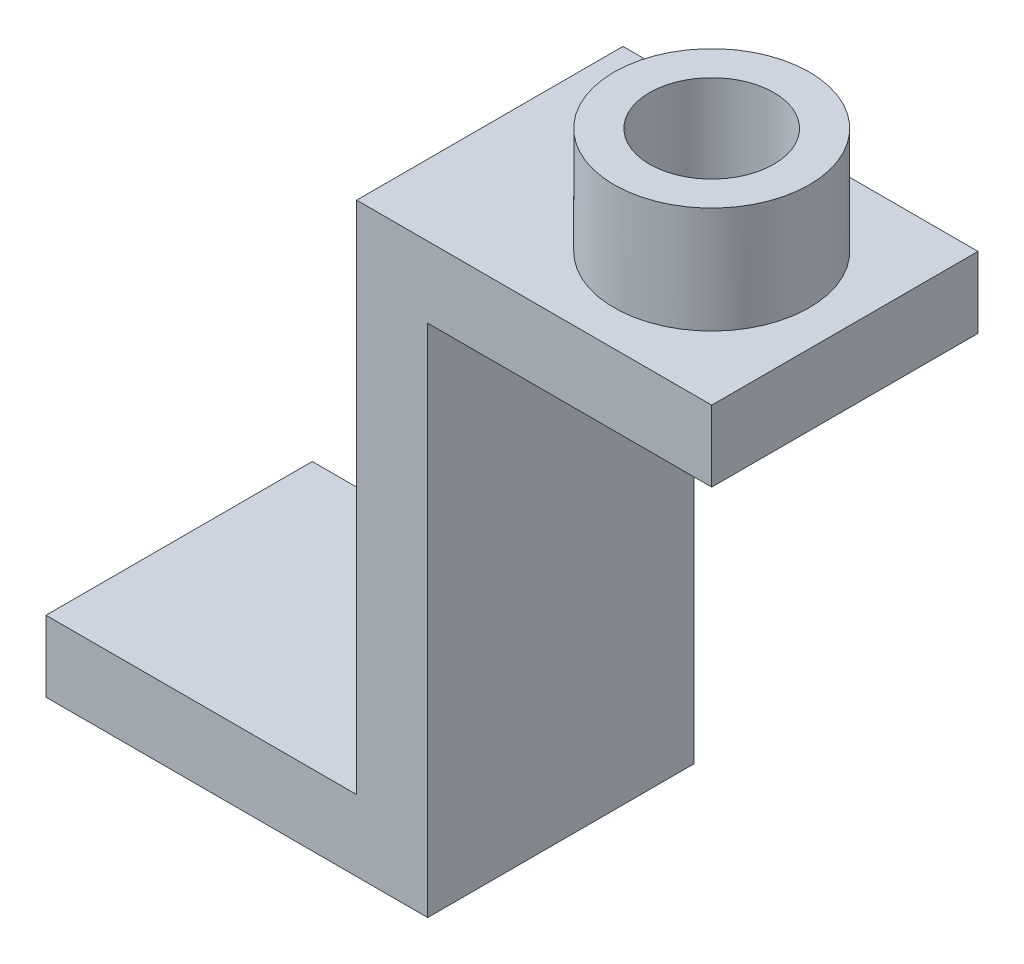
ISO-10303-21;
HEADER;
FILE_DESCRIPTION(('STEP AP214'),'2;1');
FILE_NAME('part.step','',(''),(''),'','','');
FILE_SCHEMA(('AUTOMOTIVE_DESIGN { 1 0 10303 214 1 1 1 1 }'));
ENDSEC;
DATA;
#1=APPLICATION_CONTEXT('core data for automotive mechanical design processes');
#2=APPLICATION_PROTOCOL_DEFINITION('international standard','automotive_design',2000,#1);
#3=PRODUCT_CONTEXT('',#1,'mechanical');
#4=PRODUCT('Part','Part','',(#3));
#5=PRODUCT_RELATED_PRODUCT_CATEGORY('part','',(#4));
#6=PRODUCT_DEFINITION_FORMATION('','',#4);
#7=PRODUCT_DEFINITION_CONTEXT('part definition',#1,'design');
#8=PRODUCT_DEFINITION('design','',#6,#7);
#9=PRODUCT_DEFINITION_SHAPE('','',#8);
#10=(LENGTH_UNIT() NAMED_UNIT(*) SI_UNIT(.MILLI.,.METRE.));
#11=(NAMED_UNIT(*) PLANE_ANGLE_UNIT() SI_UNIT($,.RADIAN.));
#12=(NAMED_UNIT(*) SI_UNIT($,.STERADIAN.) SOLID_ANGLE_UNIT());
#13=UNCERTAINTY_MEASURE_WITH_UNIT(LENGTH_MEASURE(1.E-05),#10,'distance_accuracy_value','');
#14=(GEOMETRIC_REPRESENTATION_CONTEXT(3) GLOBAL_UNCERTAINTY_ASSIGNED_CONTEXT((#13)) GLOBAL_UNIT_ASSIGNED_CONTEXT((#10,
#11,#12)) REPRESENTATION_CONTEXT('',''));
#15=CARTESIAN_POINT('',(0.,0.,0.));
#16=DIRECTION('',(0.,0.,1.));
#17=DIRECTION('',(1.,0.,0.));
#18=AXIS2_PLACEMENT_3D('',#15,#16,#17);
#19=CARTESIAN_POINT('',(0.,8.,-30.));
#20=DIRECTION('',(0.,-1.,0.));
#21=DIRECTION('',(0.,0.,-1.));
#22=AXIS2_PLACEMENT_3D('',#19,#20,#21);
#23=PLANE('',#22);
#24=DIRECTION('',(1.,0.,0.));
#25=VECTOR('',#24,1.);
#26=CARTESIAN_POINT('',(0.,8.,0.));
#27=LINE('',#26,#25);
#28=CARTESIAN_POINT('',(0.,8.,0.));
#29=VERTEX_POINT('',#28);
#30=CARTESIAN_POINT('',(35.,8.,0.));
#31=VERTEX_POINT('',#30);
#32=EDGE_CURVE('E134',#29,#31,#27,.T.);
#33=ORIENTED_EDGE('',*,*,#32,.T.);
#34=DIRECTION('',(0.,0.,1.));
#35=VECTOR('',#34,1.);
#36=CARTESIAN_POINT('',(35.,8.,-30.));
#37=LINE('',#36,#35);
#38=CARTESIAN_POINT('',(35.,8.,-30.));
#39=VERTEX_POINT('',#38);
#40=EDGE_CURVE('E44',#39,#31,#37,.T.);
#41=ORIENTED_EDGE('',*,*,#40,.F.);
#42=DIRECTION('',(1.,0.,0.));
#43=VECTOR('',#42,1.);
#44=CARTESIAN_POINT('',(0.,8.,-30.));
#45=LINE('',#44,#43);
#46=CARTESIAN_POINT('',(0.,8.,-30.));
#47=VERTEX_POINT('',#46);
#48=EDGE_CURVE('E154',#47,#39,#45,.T.);
#49=ORIENTED_EDGE('',*,*,#48,.F.);
#50=DIRECTION('',(0.,0.,1.));
#51=VECTOR('',#50,1.);
#52=CARTESIAN_POINT('',(0.,8.,-30.));
#53=LINE('',#52,#51);
#54=EDGE_CURVE('E90',#47,#29,#53,.T.);
#55=ORIENTED_EDGE('',*,*,#54,.T.);
#56=EDGE_LOOP('',(#33,#41,#49,#55));
#57=FACE_BOUND('',#56,.T.);
#58=ADVANCED_FACE('F35',(#57),#23,.F.);
#59=CARTESIAN_POINT('',(35.,0.,-30.));
#60=DIRECTION('',(1.,0.,0.));
#61=DIRECTION('',(0.,1.,0.));
#62=AXIS2_PLACEMENT_3D('',#59,#60,#61);
#63=PLANE('',#62);
#64=DIRECTION('',(0.,1.,0.));
#65=VECTOR('',#64,1.);
#66=CARTESIAN_POINT('',(35.,0.,0.));
#67=LINE('',#66,#65);
#68=CARTESIAN_POINT('',(35.,66.,0.));
#69=VERTEX_POINT('',#68);
#70=EDGE_CURVE('E78',#31,#69,#67,.T.);
#71=ORIENTED_EDGE('',*,*,#70,.T.);
#72=DIRECTION('',(0.,0.,1.));
#73=VECTOR('',#72,1.);
#74=CARTESIAN_POINT('',(35.,66.,-30.));
#75=LINE('',#74,#73);
#76=CARTESIAN_POINT('',(35.,66.,-30.));
#77=VERTEX_POINT('',#76);
#78=EDGE_CURVE('E122',#77,#69,#75,.T.);
#79=ORIENTED_EDGE('',*,*,#78,.F.);
#80=DIRECTION('',(0.,1.,0.));
#81=VECTOR('',#80,1.);
#82=CARTESIAN_POINT('',(35.,0.,-30.));
#83=LINE('',#82,#81);
#84=EDGE_CURVE('E52',#39,#77,#83,.T.);
#85=ORIENTED_EDGE('',*,*,#84,.F.);
#86=ORIENTED_EDGE('',*,*,#40,.T.);
#87=EDGE_LOOP('',(#71,#79,#85,#86));
#88=FACE_BOUND('',#87,.T.);
#89=ADVANCED_FACE('F208',(#88),#63,.F.);
#90=CARTESIAN_POINT('',(0.,66.,-30.));
#91=DIRECTION('',(0.,-1.,0.));
#92=DIRECTION('',(0.,0.,-1.));
#93=AXIS2_PLACEMENT_3D('',#90,#91,#92);
#94=PLANE('',#93);
#95=CARTESIAN_POINT('',(60.,66.,-15.));
#96=DIRECTION('',(0.,-1.,0.));
#97=DIRECTION('',(0.,0.,-1.));
#98=AXIS2_PLACEMENT_3D('',#95,#96,#97);
#99=CIRCLE('',#98,11.);
#100=CARTESIAN_POINT('',(60.,66.,-26.));
#101=VERTEX_POINT('',#100);
#102=EDGE_CURVE('E11',#101,#101,#99,.F.);
#103=ORIENTED_EDGE('',*,*,#102,.F.);
#104=EDGE_LOOP('',(#103));
#105=FACE_BOUND('',#104,.T.);
#106=DIRECTION('',(1.,0.,0.));
#107=VECTOR('',#106,1.);
#108=CARTESIAN_POINT('',(0.,66.,0.));
#109=LINE('',#108,#107);
#110=CARTESIAN_POINT('',(75.,66.,0.));
#111=VERTEX_POINT('',#110);
#112=EDGE_CURVE('E118',#69,#111,#109,.T.);
#113=ORIENTED_EDGE('',*,*,#112,.T.);
#114=DIRECTION('',(0.,0.,1.));
#115=VECTOR('',#114,1.);
#116=CARTESIAN_POINT('',(75.,66.,-30.));
#117=LINE('',#116,#115);
#118=CARTESIAN_POINT('',(75.,66.,-30.));
#119=VERTEX_POINT('',#118);
#120=EDGE_CURVE('E116',#119,#111,#117,.T.);
#121=ORIENTED_EDGE('',*,*,#120,.F.);
#122=DIRECTION('',(1.,0.,0.));
#123=VECTOR('',#122,1.);
#124=CARTESIAN_POINT('',(0.,66.,-30.));
#125=LINE('',#124,#123);
#126=EDGE_CURVE('E106',#77,#119,#125,.T.);
#127=ORIENTED_EDGE('',*,*,#126,.F.);
#128=ORIENTED_EDGE('',*,*,#78,.T.);
#129=EDGE_LOOP('',(#113,#121,#127,#128));
#130=FACE_BOUND('',#129,.T.);
#131=ADVANCED_FACE('F117',(#105,#130),#94,.F.);
#132=CARTESIAN_POINT('',(75.,0.,-30.));
#133=DIRECTION('',(-1.,0.,0.));
#134=DIRECTION('',(0.,0.,1.));
#135=AXIS2_PLACEMENT_3D('',#132,#133,#134);
#136=PLANE('',#135);
#137=DIRECTION('',(0.,-1.,0.));
#138=VECTOR('',#137,1.);
#139=CARTESIAN_POINT('',(75.,0.,0.));
#140=LINE('',#139,#138);
#141=CARTESIAN_POINT('',(75.,58.,0.));
#142=VERTEX_POINT('',#141);
#143=EDGE_CURVE('E150',#111,#142,#140,.T.);
#144=ORIENTED_EDGE('',*,*,#143,.T.);
#145=DIRECTION('',(0.,0.,1.));
#146=VECTOR('',#145,1.);
#147=CARTESIAN_POINT('',(75.,58.,-30.));
#148=LINE('',#147,#146);
#149=CARTESIAN_POINT('',(75.,58.,-30.));
#150=VERTEX_POINT('',#149);
#151=EDGE_CURVE('E123',#150,#142,#148,.T.);
#152=ORIENTED_EDGE('',*,*,#151,.F.);
#153=DIRECTION('',(0.,-1.,0.));
#154=VECTOR('',#153,1.);
#155=CARTESIAN_POINT('',(75.,0.,-30.));
#156=LINE('',#155,#154);
#157=EDGE_CURVE('E111',#119,#150,#156,.T.);
#158=ORIENTED_EDGE('',*,*,#157,.F.);
#159=ORIENTED_EDGE('',*,*,#120,.T.);
#160=EDGE_LOOP('',(#144,#152,#158,#159));
#161=FACE_BOUND('',#160,.T.);
#162=ADVANCED_FACE('F125',(#161),#136,.F.);
#163=CARTESIAN_POINT('',(0.,58.,-30.));
#164=DIRECTION('',(0.,-1.,0.));
#165=DIRECTION('',(0.,0.,-1.));
#166=AXIS2_PLACEMENT_3D('',#163,#164,#165);
#167=PLANE('',#166);
#168=CARTESIAN_POINT('',(60.,58.,-15.));
#169=DIRECTION('',(0.,-1.,0.));
#170=DIRECTION('',(0.,0.,-1.));
#171=AXIS2_PLACEMENT_3D('',#168,#169,#170);
#172=CIRCLE('',#171,6.99999999999999);
#173=CARTESIAN_POINT('',(60.,58.,-22.));
#174=VERTEX_POINT('',#173);
#175=EDGE_CURVE('E38',#174,#174,#172,.T.);
#176=ORIENTED_EDGE('',*,*,#175,.F.);
#177=EDGE_LOOP('',(#176));
#178=FACE_BOUND('',#177,.T.);
#179=DIRECTION('',(1.,0.,0.));
#180=VECTOR('',#179,1.);
#181=CARTESIAN_POINT('',(0.,58.,0.));
#182=LINE('',#181,#180);
#183=CARTESIAN_POINT('',(43.,58.,0.));
#184=VERTEX_POINT('',#183);
#185=EDGE_CURVE('E147',#184,#142,#182,.T.);
#186=ORIENTED_EDGE('',*,*,#185,.F.);
#187=DIRECTION('',(0.,0.,1.));
#188=VECTOR('',#187,1.);
#189=CARTESIAN_POINT('',(43.,58.,-30.));
#190=LINE('',#189,#188);
#191=CARTESIAN_POINT('',(43.,58.,-30.));
#192=VERTEX_POINT('',#191);
#193=EDGE_CURVE('E158',#192,#184,#190,.T.);
#194=ORIENTED_EDGE('',*,*,#193,.F.);
#195=DIRECTION('',(1.,0.,0.));
#196=VECTOR('',#195,1.);
#197=CARTESIAN_POINT('',(0.,58.,-30.));
#198=LINE('',#197,#196);
#199=EDGE_CURVE('E127',#192,#150,#198,.T.);
#200=ORIENTED_EDGE('',*,*,#199,.T.);
#201=ORIENTED_EDGE('',*,*,#151,.T.);
#202=EDGE_LOOP('',(#186,#194,#200,#201));
#203=FACE_BOUND('',#202,.T.);
#204=ADVANCED_FACE('F182',(#178,#203),#167,.T.);
#205=CARTESIAN_POINT('',(43.,0.,-30.));
#206=DIRECTION('',(1.,0.,0.));
#207=DIRECTION('',(0.,0.,-1.));
#208=AXIS2_PLACEMENT_3D('',#205,#206,#207);
#209=PLANE('',#208);
#210=DIRECTION('',(0.,1.,0.));
#211=VECTOR('',#210,1.);
#212=CARTESIAN_POINT('',(43.,0.,0.));
#213=LINE('',#212,#211);
#214=CARTESIAN_POINT('',(43.,0.,0.));
#215=VERTEX_POINT('',#214);
#216=EDGE_CURVE('E144',#215,#184,#213,.T.);
#217=ORIENTED_EDGE('',*,*,#216,.F.);
#218=DIRECTION('',(0.,0.,1.));
#219=VECTOR('',#218,1.);
#220=CARTESIAN_POINT('',(43.,0.,-30.));
#221=LINE('',#220,#219);
#222=CARTESIAN_POINT('',(43.,0.,-30.));
#223=VERTEX_POINT('',#222);
#224=EDGE_CURVE('E160',#223,#215,#221,.T.);
#225=ORIENTED_EDGE('',*,*,#224,.F.);
#226=DIRECTION('',(0.,1.,0.));
#227=VECTOR('',#226,1.);
#228=CARTESIAN_POINT('',(43.,0.,-30.));
#229=LINE('',#228,#227);
#230=EDGE_CURVE('E129',#223,#192,#229,.T.);
#231=ORIENTED_EDGE('',*,*,#230,.T.);
#232=ORIENTED_EDGE('',*,*,#193,.T.);
#233=EDGE_LOOP('',(#217,#225,#231,#232));
#234=FACE_BOUND('',#233,.T.);
#235=ADVANCED_FACE('F178',(#234),#209,.T.);
#236=CARTESIAN_POINT('',(0.,0.,-30.));
#237=DIRECTION('',(0.,-1.,0.));
#238=DIRECTION('',(0.,0.,-1.));
#239=AXIS2_PLACEMENT_3D('',#236,#237,#238);
#240=PLANE('',#239);
#241=DIRECTION('',(1.,0.,0.));
#242=VECTOR('',#241,1.);
#243=CARTESIAN_POINT('',(0.,0.,0.));
#244=LINE('',#243,#242);
#245=CARTESIAN_POINT('',(0.,0.,0.));
#246=VERTEX_POINT('',#245);
#247=EDGE_CURVE('E141',#246,#215,#244,.T.);
#248=ORIENTED_EDGE('',*,*,#247,.F.);
#249=DIRECTION('',(0.,0.,1.));
#250=VECTOR('',#249,1.);
#251=CARTESIAN_POINT('',(0.,0.,-30.));
#252=LINE('',#251,#250);
#253=CARTESIAN_POINT('',(0.,0.,-30.));
#254=VERTEX_POINT('',#253);
#255=EDGE_CURVE('E162',#254,#246,#252,.T.);
#256=ORIENTED_EDGE('',*,*,#255,.F.);
#257=DIRECTION('',(1.,0.,0.));
#258=VECTOR('',#257,1.);
#259=CARTESIAN_POINT('',(0.,0.,-30.));
#260=LINE('',#259,#258);
#261=EDGE_CURVE('E183',#254,#223,#260,.T.);
#262=ORIENTED_EDGE('',*,*,#261,.T.);
#263=ORIENTED_EDGE('',*,*,#224,.T.);
#264=EDGE_LOOP('',(#248,#256,#262,#263));
#265=FACE_BOUND('',#264,.T.);
#266=ADVANCED_FACE('F174',(#265),#240,.T.);
#267=CARTESIAN_POINT('',(0.,0.,-30.));
#268=DIRECTION('',(-1.,0.,0.));
#269=DIRECTION('',(0.,-1.,0.));
#270=AXIS2_PLACEMENT_3D('',#267,#268,#269);
#271=PLANE('',#270);
#272=DIRECTION('',(0.,-1.,0.));
#273=VECTOR('',#272,1.);
#274=CARTESIAN_POINT('',(0.,0.,0.));
#275=LINE('',#274,#273);
#276=EDGE_CURVE('E137',#29,#246,#275,.T.);
#277=ORIENTED_EDGE('',*,*,#276,.F.);
#278=ORIENTED_EDGE('',*,*,#54,.F.);
#279=DIRECTION('',(0.,-1.,0.));
#280=VECTOR('',#279,1.);
#281=CARTESIAN_POINT('',(0.,0.,-30.));
#282=LINE('',#281,#280);
#283=EDGE_CURVE('E170',#47,#254,#282,.T.);
#284=ORIENTED_EDGE('',*,*,#283,.T.);
#285=ORIENTED_EDGE('',*,*,#255,.T.);
#286=EDGE_LOOP('',(#277,#278,#284,#285));
#287=FACE_BOUND('',#286,.T.);
#288=ADVANCED_FACE('F168',(#287),#271,.T.);
#289=CARTESIAN_POINT('',(0.,0.,-30.));
#290=DIRECTION('',(0.,0.,1.));
#291=DIRECTION('',(1.,0.,0.));
#292=AXIS2_PLACEMENT_3D('',#289,#290,#291);
#293=PLANE('',#292);
#294=ORIENTED_EDGE('',*,*,#48,.T.);
#295=ORIENTED_EDGE('',*,*,#84,.T.);
#296=ORIENTED_EDGE('',*,*,#126,.T.);
#297=ORIENTED_EDGE('',*,*,#157,.T.);
#298=ORIENTED_EDGE('',*,*,#199,.F.);
#299=ORIENTED_EDGE('',*,*,#230,.F.);
#300=ORIENTED_EDGE('',*,*,#261,.F.);
#301=ORIENTED_EDGE('',*,*,#283,.F.);
#302=EDGE_LOOP('',(#294,#295,#296,#297,#298,#299,#300,#301));
#303=FACE_BOUND('',#302,.T.);
#304=ADVANCED_FACE('F108',(#303),#293,.F.);
#305=CARTESIAN_POINT('',(0.,0.,0.));
#306=DIRECTION('',(0.,0.,1.));
#307=DIRECTION('',(1.,0.,0.));
#308=AXIS2_PLACEMENT_3D('',#305,#306,#307);
#309=PLANE('',#308);
#310=ORIENTED_EDGE('',*,*,#32,.F.);
#311=ORIENTED_EDGE('',*,*,#276,.T.);
#312=ORIENTED_EDGE('',*,*,#247,.T.);
#313=ORIENTED_EDGE('',*,*,#216,.T.);
#314=ORIENTED_EDGE('',*,*,#185,.T.);
#315=ORIENTED_EDGE('',*,*,#143,.F.);
#316=ORIENTED_EDGE('',*,*,#112,.F.);
#317=ORIENTED_EDGE('',*,*,#70,.F.);
#318=EDGE_LOOP('',(#310,#311,#312,#313,#314,#315,#316,#317));
#319=FACE_BOUND('',#318,.T.);
#320=ADVANCED_FACE('F167',(#319),#309,.T.);
#321=CARTESIAN_POINT('',(60.,78.,-15.));
#322=DIRECTION('',(0.,1.,0.));
#323=DIRECTION('',(0.,0.,1.));
#324=AXIS2_PLACEMENT_3D('',#321,#322,#323);
#325=PLANE('',#324);
#326=CARTESIAN_POINT('',(60.,78.,-15.));
#327=DIRECTION('',(0.,1.,0.));
#328=DIRECTION('',(0.,0.,1.));
#329=AXIS2_PLACEMENT_3D('',#326,#327,#328);
#330=CIRCLE('',#329,11.);
#331=CARTESIAN_POINT('',(60.,78.,-4.));
#332=VERTEX_POINT('',#331);
#333=EDGE_CURVE('E138',#332,#332,#330,.T.);
#334=ORIENTED_EDGE('',*,*,#333,.T.);
#335=EDGE_LOOP('',(#334));
#336=FACE_BOUND('',#335,.T.);
#337=CARTESIAN_POINT('',(60.,78.,-15.));
#338=DIRECTION('',(0.,1.,0.));
#339=DIRECTION('',(0.,0.,1.));
#340=AXIS2_PLACEMENT_3D('',#337,#338,#339);
#341=CIRCLE('',#340,6.99999999999999);
#342=CARTESIAN_POINT('',(60.,78.,-8.00000000000001));
#343=VERTEX_POINT('',#342);
#344=EDGE_CURVE('E190',#343,#343,#341,.T.);
#345=ORIENTED_EDGE('',*,*,#344,.F.);
#346=EDGE_LOOP('',(#345));
#347=FACE_BOUND('',#346,.T.);
#348=ADVANCED_FACE('F221',(#336,#347),#325,.T.);
#349=CARTESIAN_POINT('',(60.,78.,-15.));
#350=DIRECTION('',(0.,-1.,0.));
#351=DIRECTION('',(0.,0.,-1.));
#352=AXIS2_PLACEMENT_3D('',#349,#350,#351);
#353=CYLINDRICAL_SURFACE('',#352,11.);
#354=ORIENTED_EDGE('',*,*,#333,.F.);
#355=EDGE_LOOP('',(#354));
#356=FACE_BOUND('',#355,.T.);
#357=ORIENTED_EDGE('',*,*,#102,.T.);
#358=EDGE_LOOP('',(#357));
#359=FACE_BOUND('',#358,.T.);
#360=ADVANCED_FACE('F224',(#356,#359),#353,.T.);
#361=CARTESIAN_POINT('',(60.,78.,-15.));
#362=DIRECTION('',(0.,-1.,0.));
#363=DIRECTION('',(0.,0.,-1.));
#364=AXIS2_PLACEMENT_3D('',#361,#362,#363);
#365=CYLINDRICAL_SURFACE('',#364,6.99999999999999);
#366=ORIENTED_EDGE('',*,*,#344,.T.);
#367=EDGE_LOOP('',(#366));
#368=FACE_BOUND('',#367,.T.);
#369=ORIENTED_EDGE('',*,*,#175,.T.);
#370=EDGE_LOOP('',(#369));
#371=FACE_BOUND('',#370,.T.);
#372=ADVANCED_FACE('F197',(#368,#371),#365,.F.);
#373=CLOSED_SHELL('',(#58,#89,#131,#162,#204,#235,#266,#288,#304,#320,#348,#360,#372));
#374=MANIFOLD_SOLID_BREP('B2',#373);
#375=ADVANCED_BREP_SHAPE_REPRESENTATION('',(#18,#374),#14);
#376=SHAPE_DEFINITION_REPRESENTATION(#9,#375);
ENDSEC;
END-ISO-10303-21;
